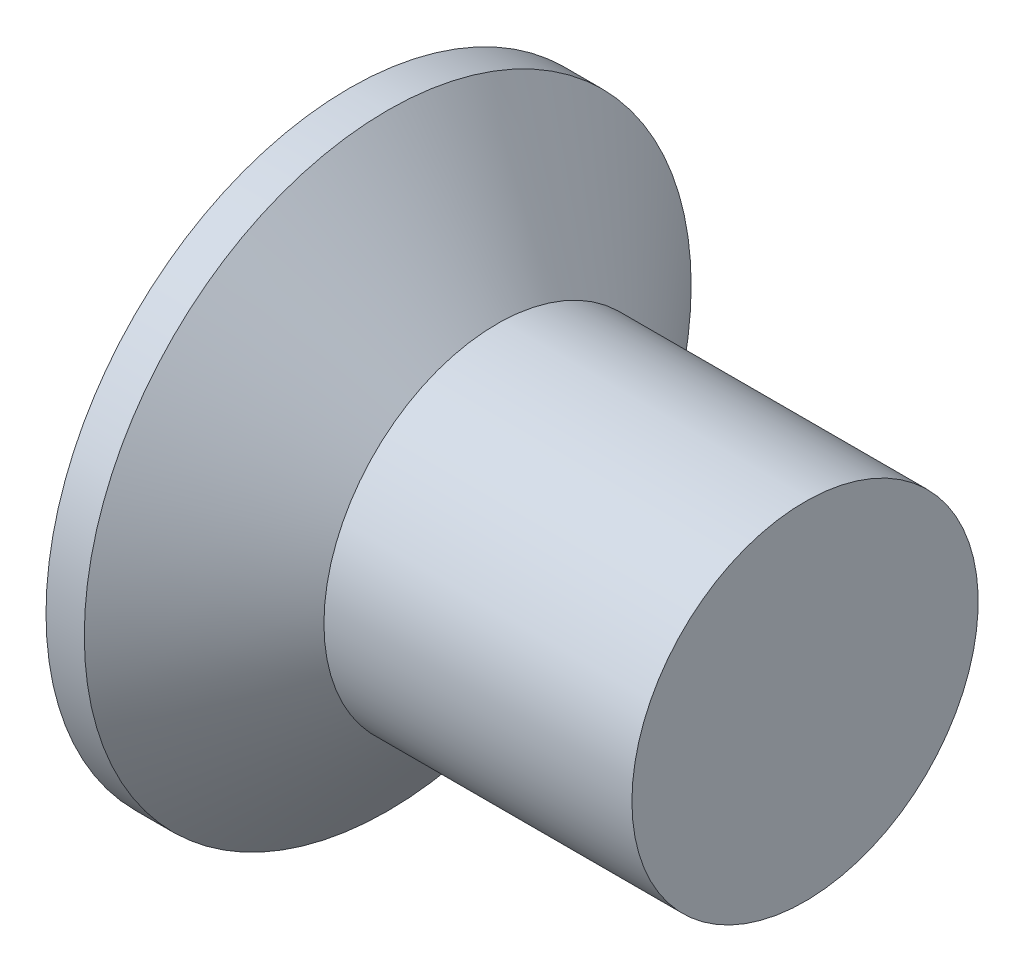
ISO-10303-21;
HEADER;
FILE_DESCRIPTION(('STEP AP214'),'2;1');
FILE_NAME('part.step','',(''),(''),'','','');
FILE_SCHEMA(('AUTOMOTIVE_DESIGN { 1 0 10303 214 1 1 1 1 }'));
ENDSEC;
DATA;
#1=APPLICATION_CONTEXT('core data for automotive mechanical design processes');
#2=APPLICATION_PROTOCOL_DEFINITION('international standard','automotive_design',2000,#1);
#3=PRODUCT_CONTEXT('',#1,'mechanical');
#4=PRODUCT('Part','Part','',(#3));
#5=PRODUCT_RELATED_PRODUCT_CATEGORY('part','',(#4));
#6=PRODUCT_DEFINITION_FORMATION('','',#4);
#7=PRODUCT_DEFINITION_CONTEXT('part definition',#1,'design');
#8=PRODUCT_DEFINITION('design','',#6,#7);
#9=PRODUCT_DEFINITION_SHAPE('','',#8);
#10=(LENGTH_UNIT() NAMED_UNIT(*) SI_UNIT(.MILLI.,.METRE.));
#11=(NAMED_UNIT(*) PLANE_ANGLE_UNIT() SI_UNIT($,.RADIAN.));
#12=(NAMED_UNIT(*) SI_UNIT($,.STERADIAN.) SOLID_ANGLE_UNIT());
#13=UNCERTAINTY_MEASURE_WITH_UNIT(LENGTH_MEASURE(1.E-05),#10,'distance_accuracy_value','');
#14=(GEOMETRIC_REPRESENTATION_CONTEXT(3) GLOBAL_UNCERTAINTY_ASSIGNED_CONTEXT((#13)) GLOBAL_UNIT_ASSIGNED_CONTEXT((#10,
#11,#12)) REPRESENTATION_CONTEXT('',''));
#15=CARTESIAN_POINT('',(0.,0.,0.));
#16=DIRECTION('',(0.,0.,1.));
#17=DIRECTION('',(1.,0.,0.));
#18=AXIS2_PLACEMENT_3D('',#15,#16,#17);
#19=CARTESIAN_POINT('',(0.,0.,0.));
#20=DIRECTION('',(-1.,0.,0.));
#21=DIRECTION('',(0.,0.,1.));
#22=AXIS2_PLACEMENT_3D('',#19,#20,#21);
#23=PLANE('',#22);
#24=CARTESIAN_POINT('',(0.,0.,0.));
#25=DIRECTION('',(-1.,0.,0.));
#26=DIRECTION('',(0.,0.,1.));
#27=AXIS2_PLACEMENT_3D('',#24,#25,#26);
#28=CIRCLE('',#27,4.2291);
#29=CARTESIAN_POINT('',(0.,0.,4.2291));
#30=VERTEX_POINT('',#29);
#31=EDGE_CURVE('E39',#30,#30,#28,.T.);
#32=ORIENTED_EDGE('',*,*,#31,.T.);
#33=EDGE_LOOP('',(#32));
#34=FACE_BOUND('',#33,.T.);
#35=DIRECTION('',(0.,1.,0.));
#36=VECTOR('',#35,1.);
#37=CARTESIAN_POINT('',(0.,-2.8575,-0.533399999999999));
#38=LINE('',#37,#36);
#39=CARTESIAN_POINT('',(0.,-2.8575,-0.533399999999999));
#40=VERTEX_POINT('',#39);
#41=CARTESIAN_POINT('',(0.,-0.533399999999998,-0.533399999999999));
#42=VERTEX_POINT('',#41);
#43=EDGE_CURVE('E100',#40,#42,#38,.T.);
#44=ORIENTED_EDGE('',*,*,#43,.T.);
#45=DIRECTION('',(0.,0.,-1.));
#46=VECTOR('',#45,1.);
#47=CARTESIAN_POINT('',(0.,-0.53340000000001,2.8575));
#48=LINE('',#47,#46);
#49=CARTESIAN_POINT('',(0.,-0.53339999999999,-2.8575));
#50=VERTEX_POINT('',#49);
#51=EDGE_CURVE('E80',#42,#50,#48,.T.);
#52=ORIENTED_EDGE('',*,*,#51,.T.);
#53=DIRECTION('',(0.,1.,0.));
#54=VECTOR('',#53,1.);
#55=CARTESIAN_POINT('',(0.,-0.53339999999999,-2.8575));
#56=LINE('',#55,#54);
#57=CARTESIAN_POINT('',(0.,0.533400000000009,-2.8575));
#58=VERTEX_POINT('',#57);
#59=EDGE_CURVE('E335',#50,#58,#56,.T.);
#60=ORIENTED_EDGE('',*,*,#59,.T.);
#61=DIRECTION('',(0.,0.,1.));
#62=VECTOR('',#61,1.);
#63=CARTESIAN_POINT('',(0.,0.533400000000009,-2.8575));
#64=LINE('',#63,#62);
#65=CARTESIAN_POINT('',(0.,0.533400000000001,-0.533399999999999));
#66=VERTEX_POINT('',#65);
#67=EDGE_CURVE('E96',#58,#66,#64,.T.);
#68=ORIENTED_EDGE('',*,*,#67,.T.);
#69=CARTESIAN_POINT('',(0.,2.8575,-0.533399999999999));
#70=VERTEX_POINT('',#69);
#71=EDGE_CURVE('E90',#66,#70,#38,.T.);
#72=ORIENTED_EDGE('',*,*,#71,.T.);
#73=DIRECTION('',(0.,0.,1.));
#74=VECTOR('',#73,1.);
#75=CARTESIAN_POINT('',(0.,2.8575,-0.533399999999999));
#76=LINE('',#75,#74);
#77=CARTESIAN_POINT('',(0.,2.8575,0.5334));
#78=VERTEX_POINT('',#77);
#79=EDGE_CURVE('E93',#70,#78,#76,.T.);
#80=ORIENTED_EDGE('',*,*,#79,.T.);
#81=DIRECTION('',(0.,-1.,0.));
#82=VECTOR('',#81,1.);
#83=CARTESIAN_POINT('',(0.,2.8575,0.5334));
#84=LINE('',#83,#82);
#85=CARTESIAN_POINT('',(0.,0.533399999999997,0.5334));
#86=VERTEX_POINT('',#85);
#87=EDGE_CURVE('E347',#78,#86,#84,.T.);
#88=ORIENTED_EDGE('',*,*,#87,.T.);
#89=CARTESIAN_POINT('',(0.,0.533399999999989,2.8575));
#90=VERTEX_POINT('',#89);
#91=EDGE_CURVE('E330',#86,#90,#64,.T.);
#92=ORIENTED_EDGE('',*,*,#91,.T.);
#93=DIRECTION('',(0.,-1.,0.));
#94=VECTOR('',#93,1.);
#95=CARTESIAN_POINT('',(0.,0.533399999999989,2.8575));
#96=LINE('',#95,#94);
#97=CARTESIAN_POINT('',(0.,-0.53340000000001,2.8575));
#98=VERTEX_POINT('',#97);
#99=EDGE_CURVE('E316',#90,#98,#96,.T.);
#100=ORIENTED_EDGE('',*,*,#99,.T.);
#101=CARTESIAN_POINT('',(0.,-0.533400000000002,0.533400000000001));
#102=VERTEX_POINT('',#101);
#103=EDGE_CURVE('E328',#98,#102,#48,.T.);
#104=ORIENTED_EDGE('',*,*,#103,.T.);
#105=CARTESIAN_POINT('',(0.,-2.8575,0.5334));
#106=VERTEX_POINT('',#105);
#107=EDGE_CURVE('E106',#102,#106,#84,.T.);
#108=ORIENTED_EDGE('',*,*,#107,.T.);
#109=DIRECTION('',(0.,0.,-1.));
#110=VECTOR('',#109,1.);
#111=CARTESIAN_POINT('',(0.,-2.8575,0.5334));
#112=LINE('',#111,#110);
#113=EDGE_CURVE('E129',#106,#40,#112,.T.);
#114=ORIENTED_EDGE('',*,*,#113,.T.);
#115=EDGE_LOOP('',(#44,#52,#60,#68,#72,#80,#88,#92,#100,#104,#108,#114));
#116=FACE_BOUND('',#115,.T.);
#117=ADVANCED_FACE('F32',(#34,#116),#23,.T.);
#118=CARTESIAN_POINT('',(4.11816176470588,0.,0.239245588235294));
#119=DIRECTION('',(-0.0712470499879096,0.,-0.997458699830735));
#120=DIRECTION('',(-0.997458699830735,0.,0.0712470499879096));
#121=AXIS2_PLACEMENT_3D('',#118,#119,#120);
#122=PLANE('',#121);
#123=ORIENTED_EDGE('',*,*,#107,.F.);
#124=DIRECTION('',(0.994936676326182,0.0710669054518704,-0.0710669054518702));
#125=VECTOR('',#124,1.);
#126=CARTESIAN_POINT('',(4.13507811942959,-0.238037277183602,0.238037277183601));
#127=LINE('',#126,#125);
#128=CARTESIAN_POINT('',(3.7338,-0.266700000000001,0.266699999999999));
#129=VERTEX_POINT('',#128);
#130=EDGE_CURVE('E124',#102,#129,#127,.T.);
#131=ORIENTED_EDGE('',*,*,#130,.T.);
#132=DIRECTION('',(0.820177018154054,0.569102420759956,-0.0585840727252897));
#133=VECTOR('',#132,1.);
#134=CARTESIAN_POINT('',(0.,-2.8575,0.5334));
#135=LINE('',#134,#133);
#136=EDGE_CURVE('E101',#106,#129,#135,.T.);
#137=ORIENTED_EDGE('',*,*,#136,.F.);
#138=EDGE_LOOP('',(#123,#131,#137));
#139=FACE_BOUND('',#138,.T.);
#140=ADVANCED_FACE('F152',(#139),#122,.T.);
#141=DIRECTION('',(0.820177018154054,-0.569102420759956,-0.0585840727252895));
#142=VECTOR('',#141,1.);
#143=CARTESIAN_POINT('',(0.,2.8575,0.5334));
#144=LINE('',#143,#142);
#145=CARTESIAN_POINT('',(3.7338,0.2667,0.2667));
#146=VERTEX_POINT('',#145);
#147=EDGE_CURVE('E46',#78,#146,#144,.T.);
#148=ORIENTED_EDGE('',*,*,#147,.T.);
#149=DIRECTION('',(-0.994936676326182,0.0710669054518697,0.0710669054518701));
#150=VECTOR('',#149,1.);
#151=CARTESIAN_POINT('',(4.13507811942959,0.2380372771836,0.238037277183601));
#152=LINE('',#151,#150);
#153=EDGE_CURVE('E343',#146,#86,#152,.T.);
#154=ORIENTED_EDGE('',*,*,#153,.T.);
#155=ORIENTED_EDGE('',*,*,#87,.F.);
#156=EDGE_LOOP('',(#148,#154,#155));
#157=FACE_BOUND('',#156,.T.);
#158=ADVANCED_FACE('F156',(#157),#122,.T.);
#159=CARTESIAN_POINT('',(4.11816176470588,0.,-0.239245588235294));
#160=DIRECTION('',(-0.0712470499879094,0.,0.997458699830735));
#161=DIRECTION('',(0.997458699830735,0.,0.0712470499879094));
#162=AXIS2_PLACEMENT_3D('',#159,#160,#161);
#163=PLANE('',#162);
#164=DIRECTION('',(0.820177018154054,0.569102420759956,0.0585840727252894));
#165=VECTOR('',#164,1.);
#166=CARTESIAN_POINT('',(0.,-2.8575,-0.533399999999999));
#167=LINE('',#166,#165);
#168=CARTESIAN_POINT('',(3.7338,-0.266699999999999,-0.266700000000001));
#169=VERTEX_POINT('',#168);
#170=EDGE_CURVE('E55',#40,#169,#167,.T.);
#171=ORIENTED_EDGE('',*,*,#170,.T.);
#172=DIRECTION('',(-0.994936676326182,-0.0710669054518699,-0.0710669054518699));
#173=VECTOR('',#172,1.);
#174=CARTESIAN_POINT('',(4.13507811942959,-0.2380372771836,-0.238037277183601));
#175=LINE('',#174,#173);
#176=EDGE_CURVE('E11',#169,#42,#175,.T.);
#177=ORIENTED_EDGE('',*,*,#176,.T.);
#178=ORIENTED_EDGE('',*,*,#43,.F.);
#179=EDGE_LOOP('',(#171,#177,#178));
#180=FACE_BOUND('',#179,.T.);
#181=ADVANCED_FACE('F149',(#180),#163,.T.);
#182=ORIENTED_EDGE('',*,*,#71,.F.);
#183=DIRECTION('',(0.994936676326182,-0.0710669054518702,0.0710669054518699));
#184=VECTOR('',#183,1.);
#185=CARTESIAN_POINT('',(4.13507811942959,0.238037277183602,-0.238037277183601));
#186=LINE('',#185,#184);
#187=CARTESIAN_POINT('',(3.7338,0.2667,-0.2667));
#188=VERTEX_POINT('',#187);
#189=EDGE_CURVE('E109',#66,#188,#186,.T.);
#190=ORIENTED_EDGE('',*,*,#189,.T.);
#191=DIRECTION('',(0.820177018154054,-0.569102420759956,0.0585840727252894));
#192=VECTOR('',#191,1.);
#193=CARTESIAN_POINT('',(0.,2.8575,-0.533399999999999));
#194=LINE('',#193,#192);
#195=EDGE_CURVE('E105',#70,#188,#194,.T.);
#196=ORIENTED_EDGE('',*,*,#195,.F.);
#197=EDGE_LOOP('',(#182,#190,#196));
#198=FACE_BOUND('',#197,.T.);
#199=ADVANCED_FACE('F108',(#198),#163,.T.);
#200=CARTESIAN_POINT('',(-6.34999999999999,0.,0.));
#201=DIRECTION('',(-1.,0.,0.));
#202=DIRECTION('',(0.,0.,1.));
#203=AXIS2_PLACEMENT_3D('',#200,#201,#202);
#204=CYLINDRICAL_SURFACE('',#203,4.2291);
#205=CARTESIAN_POINT('',(0.533511159818948,0.,0.));
#206=DIRECTION('',(-1.,0.,0.));
#207=DIRECTION('',(0.,0.,1.));
#208=AXIS2_PLACEMENT_3D('',#205,#206,#207);
#209=CIRCLE('',#208,4.2291);
#210=CARTESIAN_POINT('',(0.533511159818948,0.,4.2291));
#211=VERTEX_POINT('',#210);
#212=EDGE_CURVE('E132',#211,#211,#209,.T.);
#213=ORIENTED_EDGE('',*,*,#212,.T.);
#214=EDGE_LOOP('',(#213));
#215=FACE_BOUND('',#214,.T.);
#216=ORIENTED_EDGE('',*,*,#31,.F.);
#217=EDGE_LOOP('',(#216));
#218=FACE_BOUND('',#217,.T.);
#219=ADVANCED_FACE('F138',(#215,#218),#204,.T.);
#220=CARTESIAN_POINT('',(0.533511159818948,0.,0.));
#221=DIRECTION('',(-1.,0.,0.));
#222=DIRECTION('',(0.,0.,1.));
#223=AXIS2_PLACEMENT_3D('',#220,#221,#222);
#224=CONICAL_SURFACE('',#223,4.2291,0.872664625997167);
#225=CARTESIAN_POINT('',(2.0574,0.,0.));
#226=DIRECTION('',(-1.,0.,0.));
#227=DIRECTION('',(0.,0.,1.));
#228=AXIS2_PLACEMENT_3D('',#225,#226,#227);
#229=CIRCLE('',#228,2.413);
#230=CARTESIAN_POINT('',(2.0574,0.,2.413));
#231=VERTEX_POINT('',#230);
#232=EDGE_CURVE('E128',#231,#231,#229,.T.);
#233=ORIENTED_EDGE('',*,*,#232,.T.);
#234=EDGE_LOOP('',(#233));
#235=FACE_BOUND('',#234,.T.);
#236=ORIENTED_EDGE('',*,*,#212,.F.);
#237=EDGE_LOOP('',(#236));
#238=FACE_BOUND('',#237,.T.);
#239=ADVANCED_FACE('F140',(#235,#238),#224,.T.);
#240=CARTESIAN_POINT('',(-6.34999999999999,0.,0.));
#241=DIRECTION('',(-1.,0.,0.));
#242=DIRECTION('',(0.,0.,1.));
#243=AXIS2_PLACEMENT_3D('',#240,#241,#242);
#244=CYLINDRICAL_SURFACE('',#243,2.413);
#245=CARTESIAN_POINT('',(6.35,0.,0.));
#246=DIRECTION('',(-1.,0.,0.));
#247=DIRECTION('',(0.,0.,1.));
#248=AXIS2_PLACEMENT_3D('',#245,#246,#247);
#249=CIRCLE('',#248,2.413);
#250=CARTESIAN_POINT('',(6.35,0.,2.413));
#251=VERTEX_POINT('',#250);
#252=EDGE_CURVE('E125',#251,#251,#249,.T.);
#253=ORIENTED_EDGE('',*,*,#252,.T.);
#254=EDGE_LOOP('',(#253));
#255=FACE_BOUND('',#254,.T.);
#256=ORIENTED_EDGE('',*,*,#232,.F.);
#257=EDGE_LOOP('',(#256));
#258=FACE_BOUND('',#257,.T.);
#259=ADVANCED_FACE('F146',(#255,#258),#244,.T.);
#260=CARTESIAN_POINT('',(6.35,2.413,0.));
#261=DIRECTION('',(1.,0.,0.));
#262=DIRECTION('',(0.,0.,-1.));
#263=AXIS2_PLACEMENT_3D('',#260,#261,#262);
#264=PLANE('',#263);
#265=ORIENTED_EDGE('',*,*,#252,.F.);
#266=EDGE_LOOP('',(#265));
#267=FACE_BOUND('',#266,.T.);
#268=ADVANCED_FACE('F176',(#267),#264,.T.);
#269=CARTESIAN_POINT('',(3.7338,0.2667,-0.2667));
#270=DIRECTION('',(1.,0.,0.));
#271=DIRECTION('',(0.,0.,-1.));
#272=AXIS2_PLACEMENT_3D('',#269,#270,#271);
#273=PLANE('',#272);
#274=DIRECTION('',(0.,1.,0.));
#275=VECTOR('',#274,1.);
#276=CARTESIAN_POINT('',(3.7338,-0.2667,-0.2667));
#277=LINE('',#276,#275);
#278=EDGE_CURVE('E120',#169,#188,#277,.T.);
#279=ORIENTED_EDGE('',*,*,#278,.F.);
#280=DIRECTION('',(0.,0.,-1.));
#281=VECTOR('',#280,1.);
#282=CARTESIAN_POINT('',(3.7338,-0.2667,0.2667));
#283=LINE('',#282,#281);
#284=EDGE_CURVE('E111',#129,#169,#283,.T.);
#285=ORIENTED_EDGE('',*,*,#284,.F.);
#286=DIRECTION('',(0.,-1.,0.));
#287=VECTOR('',#286,1.);
#288=CARTESIAN_POINT('',(3.7338,0.2667,0.2667));
#289=LINE('',#288,#287);
#290=EDGE_CURVE('E114',#146,#129,#289,.T.);
#291=ORIENTED_EDGE('',*,*,#290,.F.);
#292=DIRECTION('',(0.,0.,1.));
#293=VECTOR('',#292,1.);
#294=CARTESIAN_POINT('',(3.7338,0.2667,-0.2667));
#295=LINE('',#294,#293);
#296=EDGE_CURVE('E118',#188,#146,#295,.T.);
#297=ORIENTED_EDGE('',*,*,#296,.F.);
#298=EDGE_LOOP('',(#279,#285,#291,#297));
#299=FACE_BOUND('',#298,.T.);
#300=ADVANCED_FACE('F173',(#299),#273,.F.);
#301=CARTESIAN_POINT('',(0.,-2.8575,-0.533399999999999));
#302=DIRECTION('',(-0.570081548206294,0.821588113591424,0.));
#303=DIRECTION('',(-0.821588113591424,-0.570081548206294,0.));
#304=AXIS2_PLACEMENT_3D('',#301,#302,#303);
#305=PLANE('',#304);
#306=ORIENTED_EDGE('',*,*,#170,.F.);
#307=ORIENTED_EDGE('',*,*,#113,.F.);
#308=ORIENTED_EDGE('',*,*,#136,.T.);
#309=ORIENTED_EDGE('',*,*,#284,.T.);
#310=EDGE_LOOP('',(#306,#307,#308,#309));
#311=FACE_BOUND('',#310,.T.);
#312=ADVANCED_FACE('F165',(#311),#305,.T.);
#313=CARTESIAN_POINT('',(0.,2.8575,0.5334));
#314=DIRECTION('',(-0.570081548206294,-0.821588113591424,0.));
#315=DIRECTION('',(0.821588113591424,-0.570081548206294,0.));
#316=AXIS2_PLACEMENT_3D('',#313,#314,#315);
#317=PLANE('',#316);
#318=ORIENTED_EDGE('',*,*,#147,.F.);
#319=ORIENTED_EDGE('',*,*,#79,.F.);
#320=ORIENTED_EDGE('',*,*,#195,.T.);
#321=ORIENTED_EDGE('',*,*,#296,.T.);
#322=EDGE_LOOP('',(#318,#319,#320,#321));
#323=FACE_BOUND('',#322,.T.);
#324=ADVANCED_FACE('F104',(#323),#317,.T.);
#325=CARTESIAN_POINT('',(4.11816176470588,-0.239245588235294,0.));
#326=DIRECTION('',(-0.0712470499879096,0.997458699830735,0.));
#327=DIRECTION('',(-0.997458699830735,-0.0712470499879096,0.));
#328=AXIS2_PLACEMENT_3D('',#325,#326,#327);
#329=PLANE('',#328);
#330=DIRECTION('',(0.820177018154054,0.0585840727252877,0.569102420759956));
#331=VECTOR('',#330,1.);
#332=CARTESIAN_POINT('',(0.,-0.53339999999999,-2.8575));
#333=LINE('',#332,#331);
#334=EDGE_CURVE('E337',#50,#169,#333,.T.);
#335=ORIENTED_EDGE('',*,*,#334,.F.);
#336=ORIENTED_EDGE('',*,*,#51,.F.);
#337=ORIENTED_EDGE('',*,*,#176,.F.);
#338=EDGE_LOOP('',(#335,#336,#337));
#339=FACE_BOUND('',#338,.T.);
#340=ADVANCED_FACE('F172',(#339),#329,.T.);
#341=CARTESIAN_POINT('',(4.11816176470588,0.239245588235294,0.));
#342=DIRECTION('',(-0.0712470499879094,-0.997458699830735,0.));
#343=DIRECTION('',(0.997458699830735,-0.0712470499879094,0.));
#344=AXIS2_PLACEMENT_3D('',#341,#342,#343);
#345=PLANE('',#344);
#346=ORIENTED_EDGE('',*,*,#67,.F.);
#347=DIRECTION('',(0.820177018154054,-0.0585840727252914,0.569102420759956));
#348=VECTOR('',#347,1.);
#349=CARTESIAN_POINT('',(0.,0.533400000000009,-2.8575));
#350=LINE('',#349,#348);
#351=EDGE_CURVE('E71',#58,#188,#350,.T.);
#352=ORIENTED_EDGE('',*,*,#351,.T.);
#353=ORIENTED_EDGE('',*,*,#189,.F.);
#354=EDGE_LOOP('',(#346,#352,#353));
#355=FACE_BOUND('',#354,.T.);
#356=ADVANCED_FACE('F216',(#355),#345,.T.);
#357=CARTESIAN_POINT('',(0.,0.533400000000009,-2.8575));
#358=DIRECTION('',(-0.570081548206294,0.,0.821588113591424));
#359=DIRECTION('',(-0.821588113591424,0.,-0.570081548206294));
#360=AXIS2_PLACEMENT_3D('',#357,#358,#359);
#361=PLANE('',#360);
#362=ORIENTED_EDGE('',*,*,#351,.F.);
#363=ORIENTED_EDGE('',*,*,#59,.F.);
#364=ORIENTED_EDGE('',*,*,#334,.T.);
#365=ORIENTED_EDGE('',*,*,#278,.T.);
#366=EDGE_LOOP('',(#362,#363,#364,#365));
#367=FACE_BOUND('',#366,.T.);
#368=ADVANCED_FACE('F224',(#367),#361,.T.);
#369=ORIENTED_EDGE('',*,*,#103,.F.);
#370=DIRECTION('',(0.820177018154054,0.0585840727252915,-0.569102420759956));
#371=VECTOR('',#370,1.);
#372=CARTESIAN_POINT('',(0.,-0.53340000000001,2.8575));
#373=LINE('',#372,#371);
#374=EDGE_CURVE('E313',#98,#129,#373,.T.);
#375=ORIENTED_EDGE('',*,*,#374,.T.);
#376=ORIENTED_EDGE('',*,*,#130,.F.);
#377=EDGE_LOOP('',(#369,#375,#376));
#378=FACE_BOUND('',#377,.T.);
#379=ADVANCED_FACE('F218',(#378),#329,.T.);
#380=DIRECTION('',(0.820177018154054,-0.0585840727252874,-0.569102420759956));
#381=VECTOR('',#380,1.);
#382=CARTESIAN_POINT('',(0.,0.533399999999989,2.8575));
#383=LINE('',#382,#381);
#384=EDGE_CURVE('E324',#90,#146,#383,.T.);
#385=ORIENTED_EDGE('',*,*,#384,.F.);
#386=ORIENTED_EDGE('',*,*,#91,.F.);
#387=ORIENTED_EDGE('',*,*,#153,.F.);
#388=EDGE_LOOP('',(#385,#386,#387));
#389=FACE_BOUND('',#388,.T.);
#390=ADVANCED_FACE('F226',(#389),#345,.T.);
#391=CARTESIAN_POINT('',(0.,-0.53340000000001,2.8575));
#392=DIRECTION('',(-0.570081548206294,0.,-0.821588113591424));
#393=DIRECTION('',(0.821588113591424,0.,-0.570081548206294));
#394=AXIS2_PLACEMENT_3D('',#391,#392,#393);
#395=PLANE('',#394);
#396=ORIENTED_EDGE('',*,*,#374,.F.);
#397=ORIENTED_EDGE('',*,*,#99,.F.);
#398=ORIENTED_EDGE('',*,*,#384,.T.);
#399=ORIENTED_EDGE('',*,*,#290,.T.);
#400=EDGE_LOOP('',(#396,#397,#398,#399));
#401=FACE_BOUND('',#400,.T.);
#402=ADVANCED_FACE('F245',(#401),#395,.T.);
#403=CLOSED_SHELL('',(#117,#140,#158,#181,#199,#219,#239,#259,#268,#300,#312,#324,#340,#356,
#368,#379,#390,#402));
#404=MANIFOLD_SOLID_BREP('B2',#403);
#405=ADVANCED_BREP_SHAPE_REPRESENTATION('',(#18,#404),#14);
#406=SHAPE_DEFINITION_REPRESENTATION(#9,#405);
ENDSEC;
END-ISO-10303-21;
